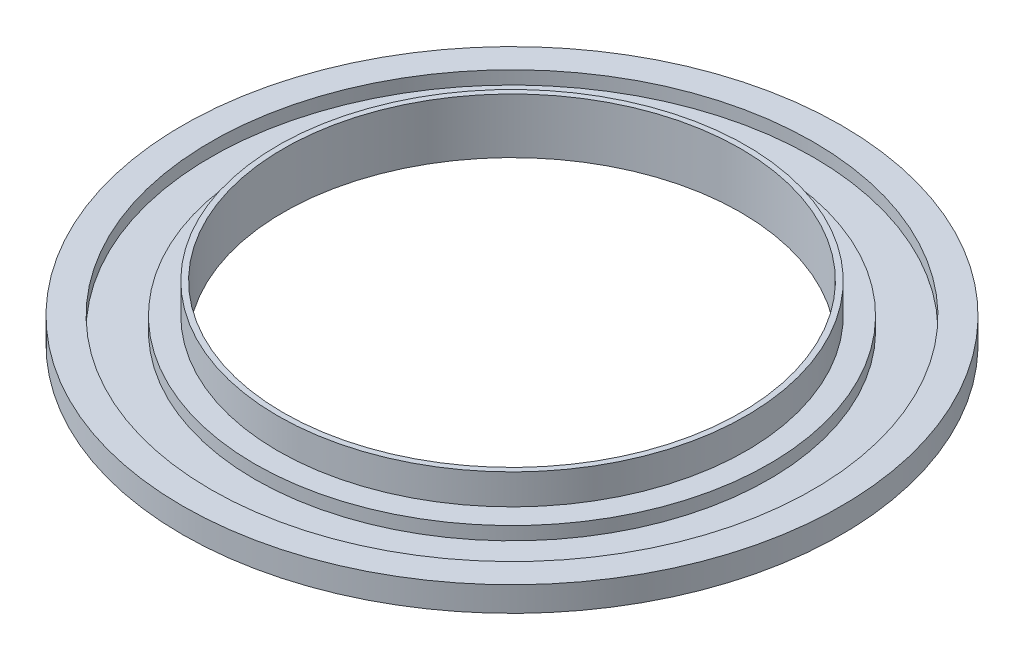
ISO-10303-21;
HEADER;
FILE_DESCRIPTION(('STEP AP214'),'2;1');
FILE_NAME('part.step','',(''),(''),'','','');
FILE_SCHEMA(('AUTOMOTIVE_DESIGN { 1 0 10303 214 1 1 1 1 }'));
ENDSEC;
DATA;
#1=APPLICATION_CONTEXT('core data for automotive mechanical design processes');
#2=APPLICATION_PROTOCOL_DEFINITION('international standard','automotive_design',2000,#1);
#3=PRODUCT_CONTEXT('',#1,'mechanical');
#4=PRODUCT('Part','Part','',(#3));
#5=PRODUCT_RELATED_PRODUCT_CATEGORY('part','',(#4));
#6=PRODUCT_DEFINITION_FORMATION('','',#4);
#7=PRODUCT_DEFINITION_CONTEXT('part definition',#1,'design');
#8=PRODUCT_DEFINITION('design','',#6,#7);
#9=PRODUCT_DEFINITION_SHAPE('','',#8);
#10=(LENGTH_UNIT() NAMED_UNIT(*) SI_UNIT(.MILLI.,.METRE.));
#11=(NAMED_UNIT(*) PLANE_ANGLE_UNIT() SI_UNIT($,.RADIAN.));
#12=(NAMED_UNIT(*) SI_UNIT($,.STERADIAN.) SOLID_ANGLE_UNIT());
#13=UNCERTAINTY_MEASURE_WITH_UNIT(LENGTH_MEASURE(1.E-05),#10,'distance_accuracy_value','');
#14=(GEOMETRIC_REPRESENTATION_CONTEXT(3) GLOBAL_UNCERTAINTY_ASSIGNED_CONTEXT((#13)) GLOBAL_UNIT_ASSIGNED_CONTEXT((#10,
#11,#12)) REPRESENTATION_CONTEXT('',''));
#15=CARTESIAN_POINT('',(0.,0.,0.));
#16=DIRECTION('',(0.,0.,1.));
#17=DIRECTION('',(1.,0.,0.));
#18=AXIS2_PLACEMENT_3D('',#15,#16,#17);
#19=CARTESIAN_POINT('',(0.,120.738006406445,0.));
#20=DIRECTION('',(0.,1.,0.));
#21=DIRECTION('',(0.,0.,1.));
#22=AXIS2_PLACEMENT_3D('',#19,#20,#21);
#23=CYLINDRICAL_SURFACE('',#22,273.25);
#24=CARTESIAN_POINT('',(0.,8.07033972915648,-3.86478150826563E-13));
#25=DIRECTION('',(0.,1.,0.));
#26=DIRECTION('',(0.,0.,1.));
#27=AXIS2_PLACEMENT_3D('',#24,#25,#26);
#28=CIRCLE('',#27,273.25);
#29=CARTESIAN_POINT('',(0.,8.07033972915554,273.25));
#30=VERTEX_POINT('',#29);
#31=EDGE_CURVE('E10',#30,#30,#28,.T.);
#32=ORIENTED_EDGE('',*,*,#31,.T.);
#33=EDGE_LOOP('',(#32));
#34=FACE_BOUND('',#33,.T.);
#35=CARTESIAN_POINT('',(0.,-3.92966027084352,-4.27641138813192E-13));
#36=DIRECTION('',(0.,1.,0.));
#37=DIRECTION('',(0.,0.,1.));
#38=AXIS2_PLACEMENT_3D('',#35,#36,#37);
#39=CIRCLE('',#38,273.25);
#40=CARTESIAN_POINT('',(0.,-3.92966027084445,273.25));
#41=VERTEX_POINT('',#40);
#42=EDGE_CURVE('E69',#41,#41,#39,.T.);
#43=ORIENTED_EDGE('',*,*,#42,.F.);
#44=EDGE_LOOP('',(#43));
#45=FACE_BOUND('',#44,.T.);
#46=ADVANCED_FACE('F35',(#34,#45),#23,.F.);
#47=CARTESIAN_POINT('',(0.,8.07033972915549,299.));
#48=DIRECTION('',(0.,1.,0.));
#49=DIRECTION('',(0.,0.,1.));
#50=AXIS2_PLACEMENT_3D('',#47,#48,#49);
#51=PLANE('',#50);
#52=CARTESIAN_POINT('',(0.,8.07033972915657,-3.86478150826563E-13));
#53=DIRECTION('',(0.,1.,0.));
#54=DIRECTION('',(0.,0.,1.));
#55=AXIS2_PLACEMENT_3D('',#52,#53,#54);
#56=CIRCLE('',#55,299.);
#57=CARTESIAN_POINT('',(0.,8.07033972915554,299.));
#58=VERTEX_POINT('',#57);
#59=EDGE_CURVE('E41',#58,#58,#56,.T.);
#60=ORIENTED_EDGE('',*,*,#59,.T.);
#61=EDGE_LOOP('',(#60));
#62=FACE_BOUND('',#61,.T.);
#63=ORIENTED_EDGE('',*,*,#31,.F.);
#64=EDGE_LOOP('',(#63));
#65=FACE_BOUND('',#64,.T.);
#66=ADVANCED_FACE('F77',(#62,#65),#51,.T.);
#67=CARTESIAN_POINT('',(0.,120.738006406445,0.));
#68=DIRECTION('',(0.,1.,0.));
#69=DIRECTION('',(0.,0.,1.));
#70=AXIS2_PLACEMENT_3D('',#67,#68,#69);
#71=CYLINDRICAL_SURFACE('',#70,299.);
#72=CARTESIAN_POINT('',(0.,-14.4467673444003,-4.63717434823435E-13));
#73=DIRECTION('',(0.,1.,0.));
#74=DIRECTION('',(0.,0.,1.));
#75=AXIS2_PLACEMENT_3D('',#72,#73,#74);
#76=CIRCLE('',#75,299.);
#77=CARTESIAN_POINT('',(0.,-14.4467673444014,299.));
#78=VERTEX_POINT('',#77);
#79=EDGE_CURVE('E45',#78,#78,#76,.T.);
#80=ORIENTED_EDGE('',*,*,#79,.T.);
#81=EDGE_LOOP('',(#80));
#82=FACE_BOUND('',#81,.T.);
#83=ORIENTED_EDGE('',*,*,#59,.F.);
#84=EDGE_LOOP('',(#83));
#85=FACE_BOUND('',#84,.T.);
#86=ADVANCED_FACE('F81',(#82,#85),#71,.T.);
#87=CARTESIAN_POINT('',(0.,-14.4467673444015,299.));
#88=DIRECTION('',(0.,-1.,0.));
#89=DIRECTION('',(0.,0.,-1.));
#90=AXIS2_PLACEMENT_3D('',#87,#88,#89);
#91=PLANE('',#90);
#92=CARTESIAN_POINT('',(0.,-14.4467673444006,-4.63717434823436E-13));
#93=DIRECTION('',(0.,1.,0.));
#94=DIRECTION('',(0.,0.,1.));
#95=AXIS2_PLACEMENT_3D('',#92,#93,#94);
#96=CIRCLE('',#95,207.5);
#97=CARTESIAN_POINT('',(0.,-14.4467673444013,207.5));
#98=VERTEX_POINT('',#97);
#99=EDGE_CURVE('E49',#98,#98,#96,.T.);
#100=ORIENTED_EDGE('',*,*,#99,.T.);
#101=EDGE_LOOP('',(#100));
#102=FACE_BOUND('',#101,.T.);
#103=ORIENTED_EDGE('',*,*,#79,.F.);
#104=EDGE_LOOP('',(#103));
#105=FACE_BOUND('',#104,.T.);
#106=ADVANCED_FACE('F85',(#102,#105),#91,.T.);
#107=CARTESIAN_POINT('',(0.,120.738006406445,0.));
#108=DIRECTION('',(0.,1.,0.));
#109=DIRECTION('',(0.,0.,1.));
#110=AXIS2_PLACEMENT_3D('',#107,#108,#109);
#111=CYLINDRICAL_SURFACE('',#110,207.5);
#112=CARTESIAN_POINT('',(0.,35.5532326555993,-2.92204984879148E-13));
#113=DIRECTION('',(0.,1.,0.));
#114=DIRECTION('',(0.,0.,1.));
#115=AXIS2_PLACEMENT_3D('',#112,#113,#114);
#116=CIRCLE('',#115,207.5);
#117=CARTESIAN_POINT('',(0.,35.5532326555986,207.5));
#118=VERTEX_POINT('',#117);
#119=EDGE_CURVE('E54',#118,#118,#116,.T.);
#120=ORIENTED_EDGE('',*,*,#119,.T.);
#121=EDGE_LOOP('',(#120));
#122=FACE_BOUND('',#121,.T.);
#123=ORIENTED_EDGE('',*,*,#99,.F.);
#124=EDGE_LOOP('',(#123));
#125=FACE_BOUND('',#124,.T.);
#126=ADVANCED_FACE('F92',(#122,#125),#111,.F.);
#127=CARTESIAN_POINT('',(0.,35.5532326555986,212.5));
#128=DIRECTION('',(0.,1.,0.));
#129=DIRECTION('',(0.,0.,1.));
#130=AXIS2_PLACEMENT_3D('',#127,#128,#129);
#131=PLANE('',#130);
#132=CARTESIAN_POINT('',(0.,35.5532326555994,-2.92204984879148E-13));
#133=DIRECTION('',(0.,1.,0.));
#134=DIRECTION('',(0.,0.,1.));
#135=AXIS2_PLACEMENT_3D('',#132,#133,#134);
#136=CIRCLE('',#135,212.5);
#137=CARTESIAN_POINT('',(0.,35.5532326555986,212.5));
#138=VERTEX_POINT('',#137);
#139=EDGE_CURVE('E57',#138,#138,#136,.T.);
#140=ORIENTED_EDGE('',*,*,#139,.T.);
#141=EDGE_LOOP('',(#140));
#142=FACE_BOUND('',#141,.T.);
#143=ORIENTED_EDGE('',*,*,#119,.F.);
#144=EDGE_LOOP('',(#143));
#145=FACE_BOUND('',#144,.T.);
#146=ADVANCED_FACE('F96',(#142,#145),#131,.T.);
#147=CARTESIAN_POINT('',(0.,120.738006406445,0.));
#148=DIRECTION('',(0.,1.,0.));
#149=DIRECTION('',(0.,0.,1.));
#150=AXIS2_PLACEMENT_3D('',#147,#148,#149);
#151=CYLINDRICAL_SURFACE('',#150,212.5);
#152=CARTESIAN_POINT('',(0.,8.07033972915627,-3.86478150826564E-13));
#153=DIRECTION('',(0.,1.,0.));
#154=DIRECTION('',(0.,0.,1.));
#155=AXIS2_PLACEMENT_3D('',#152,#153,#154);
#156=CIRCLE('',#155,212.5);
#157=CARTESIAN_POINT('',(0.,8.07033972915554,212.5));
#158=VERTEX_POINT('',#157);
#159=EDGE_CURVE('E60',#158,#158,#156,.T.);
#160=ORIENTED_EDGE('',*,*,#159,.T.);
#161=EDGE_LOOP('',(#160));
#162=FACE_BOUND('',#161,.T.);
#163=ORIENTED_EDGE('',*,*,#139,.F.);
#164=EDGE_LOOP('',(#163));
#165=FACE_BOUND('',#164,.T.);
#166=ADVANCED_FACE('F100',(#162,#165),#151,.T.);
#167=CARTESIAN_POINT('',(0.,8.0703397291555,233.25));
#168=DIRECTION('',(0.,1.,0.));
#169=DIRECTION('',(0.,0.,1.));
#170=AXIS2_PLACEMENT_3D('',#167,#168,#169);
#171=PLANE('',#170);
#172=CARTESIAN_POINT('',(0.,8.07033972915634,-3.86478150826564E-13));
#173=DIRECTION('',(0.,1.,0.));
#174=DIRECTION('',(0.,0.,1.));
#175=AXIS2_PLACEMENT_3D('',#172,#173,#174);
#176=CIRCLE('',#175,233.25);
#177=CARTESIAN_POINT('',(0.,8.07033972915554,233.25));
#178=VERTEX_POINT('',#177);
#179=EDGE_CURVE('E63',#178,#178,#176,.T.);
#180=ORIENTED_EDGE('',*,*,#179,.T.);
#181=EDGE_LOOP('',(#180));
#182=FACE_BOUND('',#181,.T.);
#183=ORIENTED_EDGE('',*,*,#159,.F.);
#184=EDGE_LOOP('',(#183));
#185=FACE_BOUND('',#184,.T.);
#186=ADVANCED_FACE('F104',(#182,#185),#171,.T.);
#187=CARTESIAN_POINT('',(0.,120.738006406445,0.));
#188=DIRECTION('',(0.,1.,0.));
#189=DIRECTION('',(0.,0.,1.));
#190=AXIS2_PLACEMENT_3D('',#187,#188,#189);
#191=CYLINDRICAL_SURFACE('',#190,233.25);
#192=CARTESIAN_POINT('',(0.,-3.92966027084365,-4.27641138813193E-13));
#193=DIRECTION('',(0.,1.,0.));
#194=DIRECTION('',(0.,0.,1.));
#195=AXIS2_PLACEMENT_3D('',#192,#193,#194);
#196=CIRCLE('',#195,233.25);
#197=CARTESIAN_POINT('',(0.,-3.92966027084445,233.25));
#198=VERTEX_POINT('',#197);
#199=EDGE_CURVE('E66',#198,#198,#196,.T.);
#200=ORIENTED_EDGE('',*,*,#199,.T.);
#201=EDGE_LOOP('',(#200));
#202=FACE_BOUND('',#201,.T.);
#203=ORIENTED_EDGE('',*,*,#179,.F.);
#204=EDGE_LOOP('',(#203));
#205=FACE_BOUND('',#204,.T.);
#206=ADVANCED_FACE('F108',(#202,#205),#191,.T.);
#207=CARTESIAN_POINT('',(0.,-3.92966027084453,273.25));
#208=DIRECTION('',(0.,1.,0.));
#209=DIRECTION('',(0.,0.,1.));
#210=AXIS2_PLACEMENT_3D('',#207,#208,#209);
#211=PLANE('',#210);
#212=ORIENTED_EDGE('',*,*,#42,.T.);
#213=EDGE_LOOP('',(#212));
#214=FACE_BOUND('',#213,.T.);
#215=ORIENTED_EDGE('',*,*,#199,.F.);
#216=EDGE_LOOP('',(#215));
#217=FACE_BOUND('',#216,.T.);
#218=ADVANCED_FACE('F73',(#214,#217),#211,.T.);
#219=CLOSED_SHELL('',(#46,#66,#86,#106,#126,#146,#166,#186,#206,#218));
#220=MANIFOLD_SOLID_BREP('B2',#219);
#221=ADVANCED_BREP_SHAPE_REPRESENTATION('',(#18,#220),#14);
#222=SHAPE_DEFINITION_REPRESENTATION(#9,#221);
ENDSEC;
END-ISO-10303-21;
